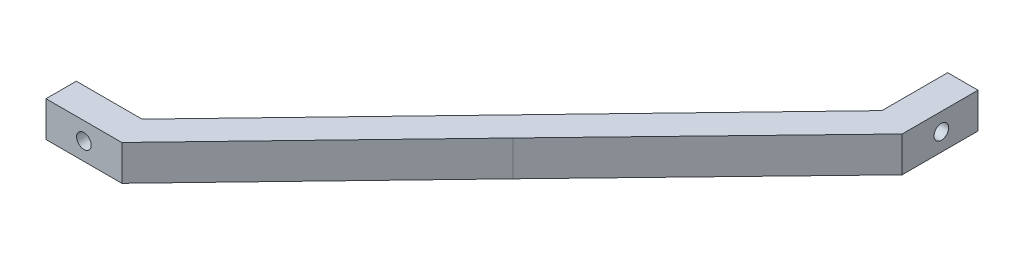
ISO-10303-21;
HEADER;
FILE_DESCRIPTION(('STEP AP214'),'2;1');
FILE_NAME('part.step','',(''),(''),'','','');
FILE_SCHEMA(('AUTOMOTIVE_DESIGN { 1 0 10303 214 1 1 1 1 }'));
ENDSEC;
DATA;
#1=APPLICATION_CONTEXT('core data for automotive mechanical design processes');
#2=APPLICATION_PROTOCOL_DEFINITION('international standard','automotive_design',2000,#1);
#3=PRODUCT_CONTEXT('',#1,'mechanical');
#4=PRODUCT('Part','Part','',(#3));
#5=PRODUCT_RELATED_PRODUCT_CATEGORY('part','',(#4));
#6=PRODUCT_DEFINITION_FORMATION('','',#4);
#7=PRODUCT_DEFINITION_CONTEXT('part definition',#1,'design');
#8=PRODUCT_DEFINITION('design','',#6,#7);
#9=PRODUCT_DEFINITION_SHAPE('','',#8);
#10=(LENGTH_UNIT() NAMED_UNIT(*) SI_UNIT(.MILLI.,.METRE.));
#11=(NAMED_UNIT(*) PLANE_ANGLE_UNIT() SI_UNIT($,.RADIAN.));
#12=(NAMED_UNIT(*) SI_UNIT($,.STERADIAN.) SOLID_ANGLE_UNIT());
#13=UNCERTAINTY_MEASURE_WITH_UNIT(LENGTH_MEASURE(1.E-05),#10,'distance_accuracy_value','');
#14=(GEOMETRIC_REPRESENTATION_CONTEXT(3) GLOBAL_UNCERTAINTY_ASSIGNED_CONTEXT((#13)) GLOBAL_UNIT_ASSIGNED_CONTEXT((#10,
#11,#12)) REPRESENTATION_CONTEXT('',''));
#15=CARTESIAN_POINT('',(0.,0.,0.));
#16=DIRECTION('',(0.,0.,1.));
#17=DIRECTION('',(1.,0.,0.));
#18=AXIS2_PLACEMENT_3D('',#15,#16,#17);
#19=CARTESIAN_POINT('',(85.5225639554594,7.,8.49999999999999));
#20=DIRECTION('',(-0.719632339789096,0.,-0.69435530928313));
#21=DIRECTION('',(-0.69435530928313,0.,0.719632339789096));
#22=AXIS2_PLACEMENT_3D('',#19,#20,#21);
#23=PLANE('',#22);
#24=DIRECTION('',(0.69435530928313,0.,-0.719632339789096));
#25=VECTOR('',#24,1.);
#26=CARTESIAN_POINT('',(85.5225639554594,0.,8.49999999999999));
#27=LINE('',#26,#25);
#28=CARTESIAN_POINT('',(47.6950576409729,0.,47.7045635909161));
#29=VERTEX_POINT('',#28);
#30=CARTESIAN_POINT('',(85.5225639554594,0.,8.49999999999999));
#31=VERTEX_POINT('',#30);
#32=EDGE_CURVE('E147',#29,#31,#27,.T.);
#33=ORIENTED_EDGE('',*,*,#32,.T.);
#34=DIRECTION('',(0.,-1.,0.));
#35=VECTOR('',#34,1.);
#36=CARTESIAN_POINT('',(85.5225639554594,7.,8.49999999999999));
#37=LINE('',#36,#35);
#38=CARTESIAN_POINT('',(85.5225639554594,7.,8.49999999999999));
#39=VERTEX_POINT('',#38);
#40=EDGE_CURVE('E11',#39,#31,#37,.T.);
#41=ORIENTED_EDGE('',*,*,#40,.F.);
#42=DIRECTION('',(0.69435530928313,0.,-0.719632339789096));
#43=VECTOR('',#42,1.);
#44=CARTESIAN_POINT('',(85.5225639554594,7.,8.49999999999999));
#45=LINE('',#44,#43);
#46=CARTESIAN_POINT('',(47.6950576409729,7.,47.7045635909161));
#47=VERTEX_POINT('',#46);
#48=EDGE_CURVE('E173',#47,#39,#45,.T.);
#49=ORIENTED_EDGE('',*,*,#48,.F.);
#50=DIRECTION('',(0.,-1.,0.));
#51=VECTOR('',#50,1.);
#52=CARTESIAN_POINT('',(47.6950576409729,7.,47.7045635909161));
#53=LINE('',#52,#51);
#54=EDGE_CURVE('E143',#47,#29,#53,.T.);
#55=ORIENTED_EDGE('',*,*,#54,.T.);
#56=EDGE_LOOP('',(#33,#41,#49,#55));
#57=FACE_BOUND('',#56,.T.);
#58=ADVANCED_FACE('F39',(#57),#23,.F.);
#59=CARTESIAN_POINT('',(85.5225639554594,7.,-6.50000000000001));
#60=DIRECTION('',(-1.,0.,0.));
#61=DIRECTION('',(0.,0.,1.));
#62=AXIS2_PLACEMENT_3D('',#59,#60,#61);
#63=PLANE('',#62);
#64=CARTESIAN_POINT('',(85.5225639554594,3.5,0.750000000000001));
#65=DIRECTION('',(-1.,0.,0.));
#66=DIRECTION('',(0.,0.,1.));
#67=AXIS2_PLACEMENT_3D('',#64,#65,#66);
#68=CIRCLE('',#67,1.45);
#69=CARTESIAN_POINT('',(85.5225639554594,3.5,2.2));
#70=VERTEX_POINT('',#69);
#71=EDGE_CURVE('E231',#70,#70,#68,.T.);
#72=ORIENTED_EDGE('',*,*,#71,.T.);
#73=EDGE_LOOP('',(#72));
#74=FACE_BOUND('',#73,.T.);
#75=DIRECTION('',(0.,0.,-1.));
#76=VECTOR('',#75,1.);
#77=CARTESIAN_POINT('',(85.5225639554594,0.,-6.50000000000001));
#78=LINE('',#77,#76);
#79=CARTESIAN_POINT('',(85.5225639554594,0.,-6.50000000000001));
#80=VERTEX_POINT('',#79);
#81=EDGE_CURVE('E151',#31,#80,#78,.T.);
#82=ORIENTED_EDGE('',*,*,#81,.T.);
#83=DIRECTION('',(0.,-1.,0.));
#84=VECTOR('',#83,1.);
#85=CARTESIAN_POINT('',(85.5225639554594,7.,-6.50000000000001));
#86=LINE('',#85,#84);
#87=CARTESIAN_POINT('',(85.5225639554594,7.,-6.50000000000001));
#88=VERTEX_POINT('',#87);
#89=EDGE_CURVE('E49',#88,#80,#86,.T.);
#90=ORIENTED_EDGE('',*,*,#89,.F.);
#91=DIRECTION('',(0.,0.,-1.));
#92=VECTOR('',#91,1.);
#93=CARTESIAN_POINT('',(85.5225639554594,7.,-6.50000000000001));
#94=LINE('',#93,#92);
#95=EDGE_CURVE('E103',#39,#88,#94,.T.);
#96=ORIENTED_EDGE('',*,*,#95,.F.);
#97=ORIENTED_EDGE('',*,*,#40,.T.);
#98=EDGE_LOOP('',(#82,#90,#96,#97));
#99=FACE_BOUND('',#98,.T.);
#100=ADVANCED_FACE('F251',(#74,#99),#63,.F.);
#101=CARTESIAN_POINT('',(79.5225639554594,7.,-6.5));
#102=DIRECTION('',(0.,0.,1.));
#103=DIRECTION('',(1.,0.,0.));
#104=AXIS2_PLACEMENT_3D('',#101,#102,#103);
#105=PLANE('',#104);
#106=DIRECTION('',(-1.,0.,0.));
#107=VECTOR('',#106,1.);
#108=CARTESIAN_POINT('',(79.5225639554594,0.,-6.5));
#109=LINE('',#108,#107);
#110=CARTESIAN_POINT('',(79.5225639554594,0.,-6.5));
#111=VERTEX_POINT('',#110);
#112=EDGE_CURVE('E154',#80,#111,#109,.T.);
#113=ORIENTED_EDGE('',*,*,#112,.T.);
#114=DIRECTION('',(0.,-1.,0.));
#115=VECTOR('',#114,1.);
#116=CARTESIAN_POINT('',(79.5225639554594,7.,-6.5));
#117=LINE('',#116,#115);
#118=CARTESIAN_POINT('',(79.5225639554594,7.,-6.5));
#119=VERTEX_POINT('',#118);
#120=EDGE_CURVE('E188',#119,#111,#117,.T.);
#121=ORIENTED_EDGE('',*,*,#120,.F.);
#122=DIRECTION('',(-1.,0.,0.));
#123=VECTOR('',#122,1.);
#124=CARTESIAN_POINT('',(79.5225639554594,7.,-6.5));
#125=LINE('',#124,#123);
#126=EDGE_CURVE('E199',#88,#119,#125,.T.);
#127=ORIENTED_EDGE('',*,*,#126,.F.);
#128=ORIENTED_EDGE('',*,*,#89,.T.);
#129=EDGE_LOOP('',(#113,#121,#127,#128));
#130=FACE_BOUND('',#129,.T.);
#131=ADVANCED_FACE('F197',(#130),#105,.F.);
#132=CARTESIAN_POINT('',(79.5225639554594,7.,6.5));
#133=DIRECTION('',(1.,0.,0.));
#134=DIRECTION('',(0.,0.,-1.));
#135=AXIS2_PLACEMENT_3D('',#132,#133,#134);
#136=PLANE('',#135);
#137=CARTESIAN_POINT('',(79.5225639554594,3.5,0.750000000000001));
#138=DIRECTION('',(-1.,0.,0.));
#139=DIRECTION('',(0.,0.,1.));
#140=AXIS2_PLACEMENT_3D('',#137,#138,#139);
#141=CIRCLE('',#140,1.45);
#142=CARTESIAN_POINT('',(79.5225639554594,3.5,2.2));
#143=VERTEX_POINT('',#142);
#144=EDGE_CURVE('E235',#143,#143,#141,.T.);
#145=ORIENTED_EDGE('',*,*,#144,.F.);
#146=EDGE_LOOP('',(#145));
#147=FACE_BOUND('',#146,.T.);
#148=DIRECTION('',(0.,0.,1.));
#149=VECTOR('',#148,1.);
#150=CARTESIAN_POINT('',(79.5225639554594,0.,6.5));
#151=LINE('',#150,#149);
#152=CARTESIAN_POINT('',(79.5225639554594,0.,6.5));
#153=VERTEX_POINT('',#152);
#154=EDGE_CURVE('E157',#111,#153,#151,.T.);
#155=ORIENTED_EDGE('',*,*,#154,.T.);
#156=DIRECTION('',(0.,-1.,0.));
#157=VECTOR('',#156,1.);
#158=CARTESIAN_POINT('',(79.5225639554594,7.,6.5));
#159=LINE('',#158,#157);
#160=CARTESIAN_POINT('',(79.5225639554594,7.,6.5));
#161=VERTEX_POINT('',#160);
#162=EDGE_CURVE('E184',#161,#153,#159,.T.);
#163=ORIENTED_EDGE('',*,*,#162,.F.);
#164=DIRECTION('',(0.,0.,1.));
#165=VECTOR('',#164,1.);
#166=CARTESIAN_POINT('',(79.5225639554594,7.,6.5));
#167=LINE('',#166,#165);
#168=EDGE_CURVE('E215',#119,#161,#167,.T.);
#169=ORIENTED_EDGE('',*,*,#168,.F.);
#170=ORIENTED_EDGE('',*,*,#120,.T.);
#171=EDGE_LOOP('',(#155,#163,#169,#170));
#172=FACE_BOUND('',#171,.T.);
#173=ADVANCED_FACE('F207',(#147,#172),#136,.F.);
#174=CARTESIAN_POINT('',(43.6575639554594,7.,43.825));
#175=DIRECTION('',(0.721068752365724,0.,0.692863517845859));
#176=DIRECTION('',(0.692863517845859,0.,-0.721068752365724));
#177=AXIS2_PLACEMENT_3D('',#174,#175,#176);
#178=PLANE('',#177);
#179=DIRECTION('',(-0.692863517845859,0.,0.721068752365724));
#180=VECTOR('',#179,1.);
#181=CARTESIAN_POINT('',(43.6575639554594,0.,43.825));
#182=LINE('',#181,#180);
#183=CARTESIAN_POINT('',(7.79256395545941,0.,81.15));
#184=VERTEX_POINT('',#183);
#185=EDGE_CURVE('E161',#153,#184,#182,.T.);
#186=ORIENTED_EDGE('',*,*,#185,.T.);
#187=DIRECTION('',(0.,-1.,0.));
#188=VECTOR('',#187,1.);
#189=CARTESIAN_POINT('',(7.79256395545941,7.,81.15));
#190=LINE('',#189,#188);
#191=CARTESIAN_POINT('',(7.79256395545941,7.,81.15));
#192=VERTEX_POINT('',#191);
#193=EDGE_CURVE('E180',#192,#184,#190,.T.);
#194=ORIENTED_EDGE('',*,*,#193,.F.);
#195=DIRECTION('',(-0.692863517845859,0.,0.721068752365724));
#196=VECTOR('',#195,1.);
#197=CARTESIAN_POINT('',(79.5225639554594,7.,6.5));
#198=LINE('',#197,#196);
#199=EDGE_CURVE('E213',#161,#192,#198,.T.);
#200=ORIENTED_EDGE('',*,*,#199,.F.);
#201=ORIENTED_EDGE('',*,*,#162,.T.);
#202=EDGE_LOOP('',(#186,#194,#200,#201));
#203=FACE_BOUND('',#202,.T.);
#204=ADVANCED_FACE('F211',(#203),#178,.F.);
#205=CARTESIAN_POINT('',(-5.20743604454059,7.,81.15));
#206=DIRECTION('',(0.,0.,1.));
#207=DIRECTION('',(1.,0.,0.));
#208=AXIS2_PLACEMENT_3D('',#205,#206,#207);
#209=PLANE('',#208);
#210=CARTESIAN_POINT('',(2.29256395545941,3.5,81.15));
#211=DIRECTION('',(0.,0.,-1.));
#212=DIRECTION('',(-1.,0.,0.));
#213=AXIS2_PLACEMENT_3D('',#210,#211,#212);
#214=CIRCLE('',#213,1.45);
#215=CARTESIAN_POINT('',(0.842563955459407,3.5,81.15));
#216=VERTEX_POINT('',#215);
#217=EDGE_CURVE('E227',#216,#216,#214,.T.);
#218=ORIENTED_EDGE('',*,*,#217,.F.);
#219=EDGE_LOOP('',(#218));
#220=FACE_BOUND('',#219,.T.);
#221=DIRECTION('',(-1.,0.,0.));
#222=VECTOR('',#221,1.);
#223=CARTESIAN_POINT('',(-5.20743604454059,0.,81.15));
#224=LINE('',#223,#222);
#225=CARTESIAN_POINT('',(-5.20743604454059,0.,81.15));
#226=VERTEX_POINT('',#225);
#227=EDGE_CURVE('E164',#184,#226,#224,.T.);
#228=ORIENTED_EDGE('',*,*,#227,.T.);
#229=DIRECTION('',(0.,-1.,0.));
#230=VECTOR('',#229,1.);
#231=CARTESIAN_POINT('',(-5.20743604454059,7.,81.15));
#232=LINE('',#231,#230);
#233=CARTESIAN_POINT('',(-5.20743604454059,7.,81.15));
#234=VERTEX_POINT('',#233);
#235=EDGE_CURVE('E136',#234,#226,#232,.T.);
#236=ORIENTED_EDGE('',*,*,#235,.F.);
#237=DIRECTION('',(-1.,0.,0.));
#238=VECTOR('',#237,1.);
#239=CARTESIAN_POINT('',(-5.20743604454059,7.,81.15));
#240=LINE('',#239,#238);
#241=EDGE_CURVE('E125',#192,#234,#240,.T.);
#242=ORIENTED_EDGE('',*,*,#241,.F.);
#243=ORIENTED_EDGE('',*,*,#193,.T.);
#244=EDGE_LOOP('',(#228,#236,#242,#243));
#245=FACE_BOUND('',#244,.T.);
#246=ADVANCED_FACE('F249',(#220,#245),#209,.F.);
#247=CARTESIAN_POINT('',(-5.20743604454059,7.,87.15));
#248=DIRECTION('',(1.,0.,0.));
#249=DIRECTION('',(0.,0.,-1.));
#250=AXIS2_PLACEMENT_3D('',#247,#248,#249);
#251=PLANE('',#250);
#252=DIRECTION('',(0.,0.,1.));
#253=VECTOR('',#252,1.);
#254=CARTESIAN_POINT('',(-5.20743604454059,0.,87.15));
#255=LINE('',#254,#253);
#256=CARTESIAN_POINT('',(-5.20743604454059,0.,87.15));
#257=VERTEX_POINT('',#256);
#258=EDGE_CURVE('E134',#226,#257,#255,.T.);
#259=ORIENTED_EDGE('',*,*,#258,.T.);
#260=DIRECTION('',(0.,-1.,0.));
#261=VECTOR('',#260,1.);
#262=CARTESIAN_POINT('',(-5.20743604454059,7.,87.15));
#263=LINE('',#262,#261);
#264=CARTESIAN_POINT('',(-5.20743604454059,7.,87.15));
#265=VERTEX_POINT('',#264);
#266=EDGE_CURVE('E131',#265,#257,#263,.T.);
#267=ORIENTED_EDGE('',*,*,#266,.F.);
#268=DIRECTION('',(0.,0.,1.));
#269=VECTOR('',#268,1.);
#270=CARTESIAN_POINT('',(-5.20743604454059,7.,87.15));
#271=LINE('',#270,#269);
#272=EDGE_CURVE('E119',#234,#265,#271,.T.);
#273=ORIENTED_EDGE('',*,*,#272,.F.);
#274=ORIENTED_EDGE('',*,*,#235,.T.);
#275=EDGE_LOOP('',(#259,#267,#273,#274));
#276=FACE_BOUND('',#275,.T.);
#277=ADVANCED_FACE('F132',(#276),#251,.F.);
#278=CARTESIAN_POINT('',(-5.20743604454059,7.,87.15));
#279=DIRECTION('',(0.,0.,-1.));
#280=DIRECTION('',(-1.,0.,0.));
#281=AXIS2_PLACEMENT_3D('',#278,#279,#280);
#282=PLANE('',#281);
#283=CARTESIAN_POINT('',(2.29256395545941,3.5,87.15));
#284=DIRECTION('',(0.,0.,-1.));
#285=DIRECTION('',(-1.,0.,0.));
#286=AXIS2_PLACEMENT_3D('',#283,#284,#285);
#287=CIRCLE('',#286,1.45);
#288=CARTESIAN_POINT('',(0.842563955459412,3.5,87.15));
#289=VERTEX_POINT('',#288);
#290=EDGE_CURVE('E42',#289,#289,#287,.T.);
#291=ORIENTED_EDGE('',*,*,#290,.T.);
#292=EDGE_LOOP('',(#291));
#293=FACE_BOUND('',#292,.T.);
#294=DIRECTION('',(1.,0.,0.));
#295=VECTOR('',#294,1.);
#296=CARTESIAN_POINT('',(-5.20743604454059,0.,87.15));
#297=LINE('',#296,#295);
#298=CARTESIAN_POINT('',(9.79256395545941,0.,87.15));
#299=VERTEX_POINT('',#298);
#300=EDGE_CURVE('E89',#257,#299,#297,.T.);
#301=ORIENTED_EDGE('',*,*,#300,.T.);
#302=DIRECTION('',(0.,-1.,0.));
#303=VECTOR('',#302,1.);
#304=CARTESIAN_POINT('',(9.79256395545941,7.,87.15));
#305=LINE('',#304,#303);
#306=CARTESIAN_POINT('',(9.79256395545941,7.,87.15));
#307=VERTEX_POINT('',#306);
#308=EDGE_CURVE('E137',#307,#299,#305,.T.);
#309=ORIENTED_EDGE('',*,*,#308,.F.);
#310=DIRECTION('',(1.,0.,0.));
#311=VECTOR('',#310,1.);
#312=CARTESIAN_POINT('',(-5.20743604454059,7.,87.15));
#313=LINE('',#312,#311);
#314=EDGE_CURVE('E123',#265,#307,#313,.T.);
#315=ORIENTED_EDGE('',*,*,#314,.F.);
#316=ORIENTED_EDGE('',*,*,#266,.T.);
#317=EDGE_LOOP('',(#301,#309,#315,#316));
#318=FACE_BOUND('',#317,.T.);
#319=ADVANCED_FACE('F139',(#293,#318),#282,.F.);
#320=CARTESIAN_POINT('',(9.79256395545941,7.,87.15));
#321=DIRECTION('',(-0.721068752365724,0.,-0.692863517845859));
#322=DIRECTION('',(-0.692863517845859,0.,0.721068752365724));
#323=AXIS2_PLACEMENT_3D('',#320,#321,#322);
#324=PLANE('',#323);
#325=DIRECTION('',(0.692863517845859,0.,-0.721068752365724));
#326=VECTOR('',#325,1.);
#327=CARTESIAN_POINT('',(9.79256395545941,0.,87.15));
#328=LINE('',#327,#326);
#329=EDGE_CURVE('E95',#299,#29,#328,.T.);
#330=ORIENTED_EDGE('',*,*,#329,.T.);
#331=ORIENTED_EDGE('',*,*,#54,.F.);
#332=DIRECTION('',(0.692863517845859,0.,-0.721068752365724));
#333=VECTOR('',#332,1.);
#334=CARTESIAN_POINT('',(9.79256395545941,7.,87.15));
#335=LINE('',#334,#333);
#336=EDGE_CURVE('E57',#307,#47,#335,.T.);
#337=ORIENTED_EDGE('',*,*,#336,.F.);
#338=ORIENTED_EDGE('',*,*,#308,.T.);
#339=EDGE_LOOP('',(#330,#331,#337,#338));
#340=FACE_BOUND('',#339,.T.);
#341=ADVANCED_FACE('F273',(#340),#324,.F.);
#342=CARTESIAN_POINT('',(0.,7.,0.));
#343=DIRECTION('',(0.,1.,0.));
#344=DIRECTION('',(0.,0.,1.));
#345=AXIS2_PLACEMENT_3D('',#342,#343,#344);
#346=PLANE('',#345);
#347=ORIENTED_EDGE('',*,*,#48,.T.);
#348=ORIENTED_EDGE('',*,*,#95,.T.);
#349=ORIENTED_EDGE('',*,*,#126,.T.);
#350=ORIENTED_EDGE('',*,*,#168,.T.);
#351=ORIENTED_EDGE('',*,*,#199,.T.);
#352=ORIENTED_EDGE('',*,*,#241,.T.);
#353=ORIENTED_EDGE('',*,*,#272,.T.);
#354=ORIENTED_EDGE('',*,*,#314,.T.);
#355=ORIENTED_EDGE('',*,*,#336,.T.);
#356=EDGE_LOOP('',(#347,#348,#349,#350,#351,#352,#353,#354,#355));
#357=FACE_BOUND('',#356,.T.);
#358=ADVANCED_FACE('F121',(#357),#346,.T.);
#359=CARTESIAN_POINT('',(0.,0.,0.));
#360=DIRECTION('',(0.,1.,0.));
#361=DIRECTION('',(0.,0.,1.));
#362=AXIS2_PLACEMENT_3D('',#359,#360,#361);
#363=PLANE('',#362);
#364=ORIENTED_EDGE('',*,*,#32,.F.);
#365=ORIENTED_EDGE('',*,*,#329,.F.);
#366=ORIENTED_EDGE('',*,*,#300,.F.);
#367=ORIENTED_EDGE('',*,*,#258,.F.);
#368=ORIENTED_EDGE('',*,*,#227,.F.);
#369=ORIENTED_EDGE('',*,*,#185,.F.);
#370=ORIENTED_EDGE('',*,*,#154,.F.);
#371=ORIENTED_EDGE('',*,*,#112,.F.);
#372=ORIENTED_EDGE('',*,*,#81,.F.);
#373=EDGE_LOOP('',(#364,#365,#366,#367,#368,#369,#370,#371,#372));
#374=FACE_BOUND('',#373,.T.);
#375=ADVANCED_FACE('F203',(#374),#363,.F.);
#376=CARTESIAN_POINT('',(2.29256395545942,3.5,91.15));
#377=DIRECTION('',(0.,0.,-1.));
#378=DIRECTION('',(-1.,0.,0.));
#379=AXIS2_PLACEMENT_3D('',#376,#377,#378);
#380=CYLINDRICAL_SURFACE('',#379,1.45);
#381=ORIENTED_EDGE('',*,*,#217,.T.);
#382=EDGE_LOOP('',(#381));
#383=FACE_BOUND('',#382,.T.);
#384=ORIENTED_EDGE('',*,*,#290,.F.);
#385=EDGE_LOOP('',(#384));
#386=FACE_BOUND('',#385,.T.);
#387=ADVANCED_FACE('F279',(#383,#386),#380,.F.);
#388=CARTESIAN_POINT('',(89.5225639554594,3.5,0.750000000000001));
#389=DIRECTION('',(-1.,0.,0.));
#390=DIRECTION('',(0.,0.,1.));
#391=AXIS2_PLACEMENT_3D('',#388,#389,#390);
#392=CYLINDRICAL_SURFACE('',#391,1.45);
#393=ORIENTED_EDGE('',*,*,#144,.T.);
#394=EDGE_LOOP('',(#393));
#395=FACE_BOUND('',#394,.T.);
#396=ORIENTED_EDGE('',*,*,#71,.F.);
#397=EDGE_LOOP('',(#396));
#398=FACE_BOUND('',#397,.T.);
#399=ADVANCED_FACE('F240',(#395,#398),#392,.F.);
#400=CLOSED_SHELL('',(#58,#100,#131,#173,#204,#246,#277,#319,#341,#358,#375,#387,#399));
#401=MANIFOLD_SOLID_BREP('B2',#400);
#402=ADVANCED_BREP_SHAPE_REPRESENTATION('',(#18,#401),#14);
#403=SHAPE_DEFINITION_REPRESENTATION(#9,#402);
ENDSEC;
END-ISO-10303-21;
